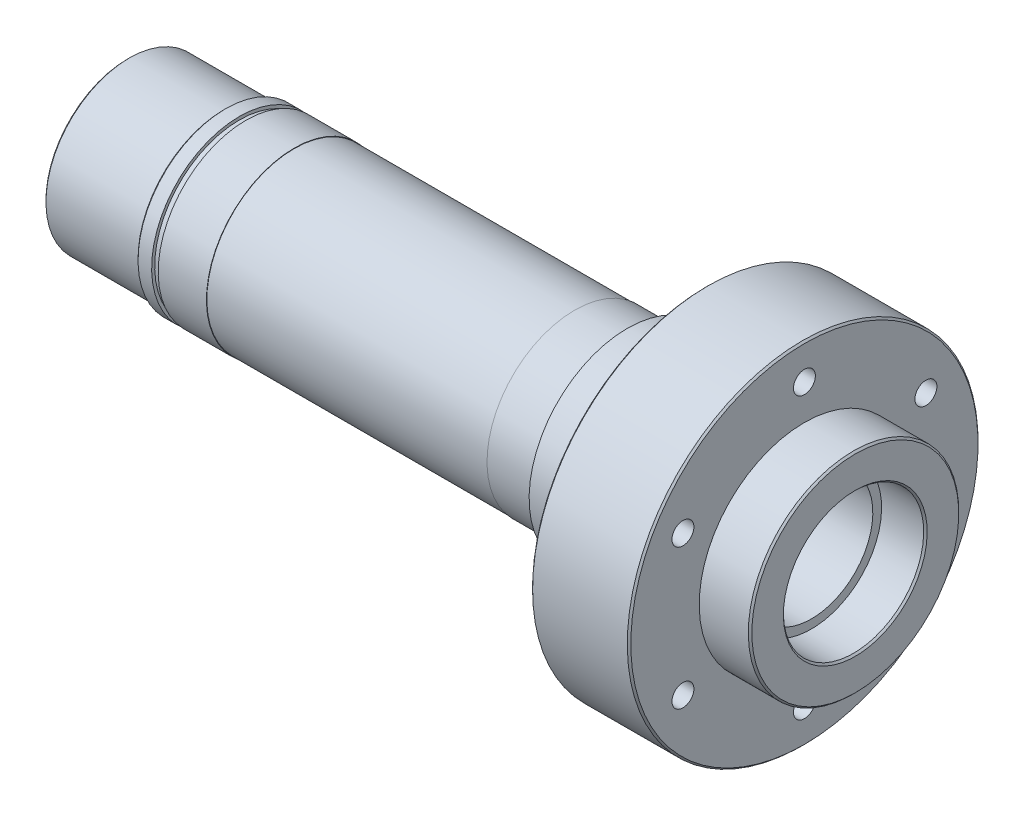
ISO-10303-21;
HEADER;
FILE_DESCRIPTION(('STEP AP214'),'2;1');
FILE_NAME('part.step','',(''),(''),'','','');
FILE_SCHEMA(('AUTOMOTIVE_DESIGN { 1 0 10303 214 1 1 1 1 }'));
ENDSEC;
DATA;
#1=APPLICATION_CONTEXT('core data for automotive mechanical design processes');
#2=APPLICATION_PROTOCOL_DEFINITION('international standard','automotive_design',2000,#1);
#3=PRODUCT_CONTEXT('',#1,'mechanical');
#4=PRODUCT('Part','Part','',(#3));
#5=PRODUCT_RELATED_PRODUCT_CATEGORY('part','',(#4));
#6=PRODUCT_DEFINITION_FORMATION('','',#4);
#7=PRODUCT_DEFINITION_CONTEXT('part definition',#1,'design');
#8=PRODUCT_DEFINITION('design','',#6,#7);
#9=PRODUCT_DEFINITION_SHAPE('','',#8);
#10=(LENGTH_UNIT() NAMED_UNIT(*) SI_UNIT(.MILLI.,.METRE.));
#11=(NAMED_UNIT(*) PLANE_ANGLE_UNIT() SI_UNIT($,.RADIAN.));
#12=(NAMED_UNIT(*) SI_UNIT($,.STERADIAN.) SOLID_ANGLE_UNIT());
#13=UNCERTAINTY_MEASURE_WITH_UNIT(LENGTH_MEASURE(1.E-05),#10,'distance_accuracy_value','');
#14=(GEOMETRIC_REPRESENTATION_CONTEXT(3) GLOBAL_UNCERTAINTY_ASSIGNED_CONTEXT((#13)) GLOBAL_UNIT_ASSIGNED_CONTEXT((#10,
#11,#12)) REPRESENTATION_CONTEXT('',''));
#15=CARTESIAN_POINT('',(0.,0.,0.));
#16=DIRECTION('',(0.,0.,1.));
#17=DIRECTION('',(1.,0.,0.));
#18=AXIS2_PLACEMENT_3D('',#15,#16,#17);
#19=CARTESIAN_POINT('',(0.,0.,0.));
#20=DIRECTION('',(1.,0.,0.));
#21=DIRECTION('',(0.,1.,0.));
#22=AXIS2_PLACEMENT_3D('',#19,#20,#21);
#23=CYLINDRICAL_SURFACE('',#22,50.);
#24=CARTESIAN_POINT('',(-16.3696821815825,0.,0.));
#25=DIRECTION('',(1.,0.,0.));
#26=DIRECTION('',(0.,1.,0.));
#27=AXIS2_PLACEMENT_3D('',#24,#25,#26);
#28=CIRCLE('',#27,50.);
#29=CARTESIAN_POINT('',(-16.3696821815825,50.,0.));
#30=VERTEX_POINT('',#29);
#31=EDGE_CURVE('E106',#30,#30,#28,.T.);
#32=ORIENTED_EDGE('',*,*,#31,.T.);
#33=EDGE_LOOP('',(#32));
#34=FACE_BOUND('',#33,.T.);
#35=CARTESIAN_POINT('',(13.6303178184175,0.,0.));
#36=DIRECTION('',(1.,0.,0.));
#37=DIRECTION('',(0.,1.,0.));
#38=AXIS2_PLACEMENT_3D('',#35,#36,#37);
#39=CIRCLE('',#38,50.);
#40=CARTESIAN_POINT('',(13.6303178184175,50.,0.));
#41=VERTEX_POINT('',#40);
#42=EDGE_CURVE('E178',#41,#41,#39,.T.);
#43=ORIENTED_EDGE('',*,*,#42,.F.);
#44=EDGE_LOOP('',(#43));
#45=FACE_BOUND('',#44,.T.);
#46=ADVANCED_FACE('F41',(#34,#45),#23,.T.);
#47=CARTESIAN_POINT('',(-16.3696821815825,-6.81524927392023E-13,0.));
#48=DIRECTION('',(-1.,0.,0.));
#49=DIRECTION('',(0.,-1.,0.));
#50=AXIS2_PLACEMENT_3D('',#47,#48,#49);
#51=PLANE('',#50);
#52=CARTESIAN_POINT('',(-16.3696821815825,0.,0.));
#53=DIRECTION('',(1.,0.,0.));
#54=DIRECTION('',(0.,1.,0.));
#55=AXIS2_PLACEMENT_3D('',#52,#53,#54);
#56=CIRCLE('',#55,49.75);
#57=CARTESIAN_POINT('',(-16.3696821815825,49.75,0.));
#58=VERTEX_POINT('',#57);
#59=EDGE_CURVE('E110',#58,#58,#56,.T.);
#60=ORIENTED_EDGE('',*,*,#59,.T.);
#61=EDGE_LOOP('',(#60));
#62=FACE_BOUND('',#61,.T.);
#63=ORIENTED_EDGE('',*,*,#31,.F.);
#64=EDGE_LOOP('',(#63));
#65=FACE_BOUND('',#64,.T.);
#66=ADVANCED_FACE('F259',(#62,#65),#51,.T.);
#67=CARTESIAN_POINT('',(0.,0.,0.));
#68=DIRECTION('',(1.,0.,0.));
#69=DIRECTION('',(0.,1.,0.));
#70=AXIS2_PLACEMENT_3D('',#67,#68,#69);
#71=CYLINDRICAL_SURFACE('',#70,49.75);
#72=ORIENTED_EDGE('',*,*,#59,.F.);
#73=EDGE_LOOP('',(#72));
#74=FACE_BOUND('',#73,.T.);
#75=CARTESIAN_POINT('',(-176.369682181583,0.,0.));
#76=DIRECTION('',(1.,0.,0.));
#77=DIRECTION('',(0.,1.,0.));
#78=AXIS2_PLACEMENT_3D('',#75,#76,#77);
#79=CIRCLE('',#78,49.75);
#80=CARTESIAN_POINT('',(-176.369682181583,49.75,0.));
#81=VERTEX_POINT('',#80);
#82=EDGE_CURVE('E114',#81,#81,#79,.T.);
#83=ORIENTED_EDGE('',*,*,#82,.T.);
#84=EDGE_LOOP('',(#83));
#85=FACE_BOUND('',#84,.T.);
#86=ADVANCED_FACE('F265',(#74,#85),#71,.T.);
#87=CARTESIAN_POINT('',(-176.369682181583,0.,0.));
#88=DIRECTION('',(-1.,0.,0.));
#89=DIRECTION('',(0.,-1.,0.));
#90=AXIS2_PLACEMENT_3D('',#87,#88,#89);
#91=PLANE('',#90);
#92=ORIENTED_EDGE('',*,*,#82,.F.);
#93=EDGE_LOOP('',(#92));
#94=FACE_BOUND('',#93,.T.);
#95=CARTESIAN_POINT('',(-176.369682181583,0.,0.));
#96=DIRECTION('',(1.,0.,0.));
#97=DIRECTION('',(0.,1.,0.));
#98=AXIS2_PLACEMENT_3D('',#95,#96,#97);
#99=CIRCLE('',#98,50.);
#100=CARTESIAN_POINT('',(-176.369682181583,50.,0.));
#101=VERTEX_POINT('',#100);
#102=EDGE_CURVE('E118',#101,#101,#99,.T.);
#103=ORIENTED_EDGE('',*,*,#102,.T.);
#104=EDGE_LOOP('',(#103));
#105=FACE_BOUND('',#104,.T.);
#106=ADVANCED_FACE('F355',(#94,#105),#91,.F.);
#107=CARTESIAN_POINT('',(0.,0.,0.));
#108=DIRECTION('',(1.,0.,0.));
#109=DIRECTION('',(0.,1.,0.));
#110=AXIS2_PLACEMENT_3D('',#107,#108,#109);
#111=CYLINDRICAL_SURFACE('',#110,50.);
#112=ORIENTED_EDGE('',*,*,#102,.F.);
#113=EDGE_LOOP('',(#112));
#114=FACE_BOUND('',#113,.T.);
#115=CARTESIAN_POINT('',(-203.869682181583,0.,0.));
#116=DIRECTION('',(1.,0.,0.));
#117=DIRECTION('',(0.,1.,0.));
#118=AXIS2_PLACEMENT_3D('',#115,#116,#117);
#119=CIRCLE('',#118,50.);
#120=CARTESIAN_POINT('',(-203.869682181583,50.,0.));
#121=VERTEX_POINT('',#120);
#122=EDGE_CURVE('E122',#121,#121,#119,.T.);
#123=ORIENTED_EDGE('',*,*,#122,.T.);
#124=EDGE_LOOP('',(#123));
#125=FACE_BOUND('',#124,.T.);
#126=ADVANCED_FACE('F351',(#114,#125),#111,.T.);
#127=CARTESIAN_POINT('',(-203.869682181583,0.,0.));
#128=DIRECTION('',(1.,0.,0.));
#129=DIRECTION('',(0.,1.,0.));
#130=AXIS2_PLACEMENT_3D('',#127,#128,#129);
#131=PLANE('',#130);
#132=ORIENTED_EDGE('',*,*,#122,.F.);
#133=EDGE_LOOP('',(#132));
#134=FACE_BOUND('',#133,.T.);
#135=CARTESIAN_POINT('',(-203.869682181583,0.,0.));
#136=DIRECTION('',(1.,0.,0.));
#137=DIRECTION('',(0.,1.,0.));
#138=AXIS2_PLACEMENT_3D('',#135,#136,#137);
#139=CIRCLE('',#138,48.25);
#140=CARTESIAN_POINT('',(-203.869682181583,48.25,0.));
#141=VERTEX_POINT('',#140);
#142=EDGE_CURVE('E126',#141,#141,#139,.T.);
#143=ORIENTED_EDGE('',*,*,#142,.T.);
#144=EDGE_LOOP('',(#143));
#145=FACE_BOUND('',#144,.T.);
#146=ADVANCED_FACE('F347',(#134,#145),#131,.F.);
#147=CARTESIAN_POINT('',(0.,0.,0.));
#148=DIRECTION('',(1.,0.,0.));
#149=DIRECTION('',(0.,1.,0.));
#150=AXIS2_PLACEMENT_3D('',#147,#148,#149);
#151=CYLINDRICAL_SURFACE('',#150,48.25);
#152=ORIENTED_EDGE('',*,*,#142,.F.);
#153=EDGE_LOOP('',(#152));
#154=FACE_BOUND('',#153,.T.);
#155=CARTESIAN_POINT('',(-207.619682181583,0.,0.));
#156=DIRECTION('',(1.,0.,0.));
#157=DIRECTION('',(0.,1.,0.));
#158=AXIS2_PLACEMENT_3D('',#155,#156,#157);
#159=CIRCLE('',#158,48.25);
#160=CARTESIAN_POINT('',(-207.619682181583,48.25,0.));
#161=VERTEX_POINT('',#160);
#162=EDGE_CURVE('E130',#161,#161,#159,.T.);
#163=ORIENTED_EDGE('',*,*,#162,.T.);
#164=EDGE_LOOP('',(#163));
#165=FACE_BOUND('',#164,.T.);
#166=ADVANCED_FACE('F343',(#154,#165),#151,.T.);
#167=CARTESIAN_POINT('',(-207.619682181583,0.,0.));
#168=DIRECTION('',(-1.,0.,0.));
#169=DIRECTION('',(0.,-1.,0.));
#170=AXIS2_PLACEMENT_3D('',#167,#168,#169);
#171=PLANE('',#170);
#172=ORIENTED_EDGE('',*,*,#162,.F.);
#173=EDGE_LOOP('',(#172));
#174=FACE_BOUND('',#173,.T.);
#175=CARTESIAN_POINT('',(-207.619682181583,0.,0.));
#176=DIRECTION('',(1.,0.,0.));
#177=DIRECTION('',(0.,1.,0.));
#178=AXIS2_PLACEMENT_3D('',#175,#176,#177);
#179=CIRCLE('',#178,50.);
#180=CARTESIAN_POINT('',(-207.619682181583,50.,0.));
#181=VERTEX_POINT('',#180);
#182=EDGE_CURVE('E134',#181,#181,#179,.T.);
#183=ORIENTED_EDGE('',*,*,#182,.T.);
#184=EDGE_LOOP('',(#183));
#185=FACE_BOUND('',#184,.T.);
#186=ADVANCED_FACE('F336',(#174,#185),#171,.F.);
#187=CARTESIAN_POINT('',(0.,0.,0.));
#188=DIRECTION('',(1.,0.,0.));
#189=DIRECTION('',(0.,1.,0.));
#190=AXIS2_PLACEMENT_3D('',#187,#188,#189);
#191=CYLINDRICAL_SURFACE('',#190,50.);
#192=CARTESIAN_POINT('',(-215.369682181583,0.,0.));
#193=DIRECTION('',(1.,0.,0.));
#194=DIRECTION('',(0.,1.,0.));
#195=AXIS2_PLACEMENT_3D('',#192,#193,#194);
#196=CIRCLE('',#195,50.);
#197=CARTESIAN_POINT('',(-215.369682181583,50.,0.));
#198=VERTEX_POINT('',#197);
#199=EDGE_CURVE('E78',#198,#198,#196,.T.);
#200=ORIENTED_EDGE('',*,*,#199,.T.);
#201=EDGE_LOOP('',(#200));
#202=FACE_BOUND('',#201,.T.);
#203=ORIENTED_EDGE('',*,*,#182,.F.);
#204=EDGE_LOOP('',(#203));
#205=FACE_BOUND('',#204,.T.);
#206=ADVANCED_FACE('F330',(#202,#205),#191,.T.);
#207=CARTESIAN_POINT('',(-216.369682181583,0.,0.));
#208=DIRECTION('',(1.,0.,0.));
#209=DIRECTION('',(0.,1.,0.));
#210=AXIS2_PLACEMENT_3D('',#207,#208,#209);
#211=PLANE('',#210);
#212=CARTESIAN_POINT('',(-216.369682181583,0.,0.));
#213=DIRECTION('',(1.,0.,0.));
#214=DIRECTION('',(0.,1.,0.));
#215=AXIS2_PLACEMENT_3D('',#212,#213,#214);
#216=CIRCLE('',#215,49.);
#217=CARTESIAN_POINT('',(-216.369682181583,49.,0.));
#218=VERTEX_POINT('',#217);
#219=EDGE_CURVE('E74',#218,#218,#216,.F.);
#220=ORIENTED_EDGE('',*,*,#219,.T.);
#221=EDGE_LOOP('',(#220));
#222=FACE_BOUND('',#221,.T.);
#223=CARTESIAN_POINT('',(-216.369682181583,0.,0.));
#224=DIRECTION('',(1.,0.,0.));
#225=DIRECTION('',(0.,1.,0.));
#226=AXIS2_PLACEMENT_3D('',#223,#224,#225);
#227=CIRCLE('',#226,47.5);
#228=CARTESIAN_POINT('',(-216.369682181583,47.5,0.));
#229=VERTEX_POINT('',#228);
#230=EDGE_CURVE('E138',#229,#229,#227,.T.);
#231=ORIENTED_EDGE('',*,*,#230,.T.);
#232=EDGE_LOOP('',(#231));
#233=FACE_BOUND('',#232,.T.);
#234=ADVANCED_FACE('F325',(#222,#233),#211,.F.);
#235=CARTESIAN_POINT('',(0.,0.,0.));
#236=DIRECTION('',(1.,0.,0.));
#237=DIRECTION('',(0.,1.,0.));
#238=AXIS2_PLACEMENT_3D('',#235,#236,#237);
#239=CYLINDRICAL_SURFACE('',#238,47.5);
#240=CARTESIAN_POINT('',(-270.369682181583,0.,0.));
#241=DIRECTION('',(1.,0.,0.));
#242=DIRECTION('',(0.,1.,0.));
#243=AXIS2_PLACEMENT_3D('',#240,#241,#242);
#244=CIRCLE('',#243,47.5);
#245=CARTESIAN_POINT('',(-270.369682181583,47.5,0.));
#246=VERTEX_POINT('',#245);
#247=EDGE_CURVE('E55',#246,#246,#244,.T.);
#248=ORIENTED_EDGE('',*,*,#247,.T.);
#249=EDGE_LOOP('',(#248));
#250=FACE_BOUND('',#249,.T.);
#251=ORIENTED_EDGE('',*,*,#230,.F.);
#252=EDGE_LOOP('',(#251));
#253=FACE_BOUND('',#252,.T.);
#254=ADVANCED_FACE('F321',(#250,#253),#239,.T.);
#255=CARTESIAN_POINT('',(-271.369682181583,0.,0.));
#256=DIRECTION('',(1.,0.,0.));
#257=DIRECTION('',(0.,1.,0.));
#258=AXIS2_PLACEMENT_3D('',#255,#256,#257);
#259=PLANE('',#258);
#260=CARTESIAN_POINT('',(-271.369682181583,0.,0.));
#261=DIRECTION('',(1.,0.,0.));
#262=DIRECTION('',(0.,1.,0.));
#263=AXIS2_PLACEMENT_3D('',#260,#261,#262);
#264=CIRCLE('',#263,40.9999999999999);
#265=CARTESIAN_POINT('',(-271.369682181583,40.9999999999999,0.));
#266=VERTEX_POINT('',#265);
#267=EDGE_CURVE('E66',#266,#266,#264,.T.);
#268=ORIENTED_EDGE('',*,*,#267,.T.);
#269=EDGE_LOOP('',(#268));
#270=FACE_BOUND('',#269,.T.);
#271=CARTESIAN_POINT('',(-271.369682181583,0.,0.));
#272=DIRECTION('',(1.,0.,0.));
#273=DIRECTION('',(0.,1.,0.));
#274=AXIS2_PLACEMENT_3D('',#271,#272,#273);
#275=CIRCLE('',#274,46.5);
#276=CARTESIAN_POINT('',(-271.369682181583,46.5,0.));
#277=VERTEX_POINT('',#276);
#278=EDGE_CURVE('E70',#277,#277,#275,.F.);
#279=ORIENTED_EDGE('',*,*,#278,.T.);
#280=EDGE_LOOP('',(#279));
#281=FACE_BOUND('',#280,.T.);
#282=ADVANCED_FACE('F324',(#270,#281),#259,.F.);
#283=CARTESIAN_POINT('',(0.,0.,0.));
#284=DIRECTION('',(1.,0.,0.));
#285=DIRECTION('',(0.,1.,0.));
#286=AXIS2_PLACEMENT_3D('',#283,#284,#285);
#287=CYLINDRICAL_SURFACE('',#286,40.);
#288=CARTESIAN_POINT('',(-270.369682181583,0.,0.));
#289=DIRECTION('',(1.,0.,0.));
#290=DIRECTION('',(0.,1.,0.));
#291=AXIS2_PLACEMENT_3D('',#288,#289,#290);
#292=CIRCLE('',#291,40.);
#293=CARTESIAN_POINT('',(-270.369682181583,40.,0.));
#294=VERTEX_POINT('',#293);
#295=EDGE_CURVE('E60',#294,#294,#292,.F.);
#296=ORIENTED_EDGE('',*,*,#295,.T.);
#297=EDGE_LOOP('',(#296));
#298=FACE_BOUND('',#297,.T.);
#299=CARTESIAN_POINT('',(-246.369682181583,0.,0.));
#300=DIRECTION('',(1.,0.,0.));
#301=DIRECTION('',(0.,1.,0.));
#302=AXIS2_PLACEMENT_3D('',#299,#300,#301);
#303=CIRCLE('',#302,40.);
#304=CARTESIAN_POINT('',(-246.369682181583,40.,0.));
#305=VERTEX_POINT('',#304);
#306=EDGE_CURVE('E142',#305,#305,#303,.T.);
#307=ORIENTED_EDGE('',*,*,#306,.T.);
#308=EDGE_LOOP('',(#307));
#309=FACE_BOUND('',#308,.T.);
#310=ADVANCED_FACE('F429',(#298,#309),#287,.F.);
#311=CARTESIAN_POINT('',(-246.369682181583,0.,0.));
#312=DIRECTION('',(-1.,0.,0.));
#313=DIRECTION('',(0.,-1.,0.));
#314=AXIS2_PLACEMENT_3D('',#311,#312,#313);
#315=PLANE('',#314);
#316=CARTESIAN_POINT('',(-246.369682181583,0.,0.));
#317=DIRECTION('',(1.,0.,0.));
#318=DIRECTION('',(0.,1.,0.));
#319=AXIS2_PLACEMENT_3D('',#316,#317,#318);
#320=CIRCLE('',#319,35.);
#321=CARTESIAN_POINT('',(-246.369682181583,35.,0.));
#322=VERTEX_POINT('',#321);
#323=EDGE_CURVE('E146',#322,#322,#320,.T.);
#324=ORIENTED_EDGE('',*,*,#323,.T.);
#325=EDGE_LOOP('',(#324));
#326=FACE_BOUND('',#325,.T.);
#327=ORIENTED_EDGE('',*,*,#306,.F.);
#328=EDGE_LOOP('',(#327));
#329=FACE_BOUND('',#328,.T.);
#330=ADVANCED_FACE('F438',(#326,#329),#315,.T.);
#331=CARTESIAN_POINT('',(0.,0.,0.));
#332=DIRECTION('',(1.,0.,0.));
#333=DIRECTION('',(0.,1.,0.));
#334=AXIS2_PLACEMENT_3D('',#331,#332,#333);
#335=CYLINDRICAL_SURFACE('',#334,35.);
#336=CARTESIAN_POINT('',(118.630317818417,0.,0.));
#337=DIRECTION('',(1.,0.,0.));
#338=DIRECTION('',(0.,1.,0.));
#339=AXIS2_PLACEMENT_3D('',#336,#337,#338);
#340=CIRCLE('',#339,35.);
#341=CARTESIAN_POINT('',(118.630317818417,35.,0.));
#342=VERTEX_POINT('',#341);
#343=EDGE_CURVE('E150',#342,#342,#340,.T.);
#344=ORIENTED_EDGE('',*,*,#343,.T.);
#345=EDGE_LOOP('',(#344));
#346=FACE_BOUND('',#345,.T.);
#347=ORIENTED_EDGE('',*,*,#323,.F.);
#348=EDGE_LOOP('',(#347));
#349=FACE_BOUND('',#348,.T.);
#350=ADVANCED_FACE('F624',(#346,#349),#335,.F.);
#351=CARTESIAN_POINT('',(118.630317818417,6.58530551303031E-13,0.));
#352=DIRECTION('',(1.,0.,0.));
#353=DIRECTION('',(0.,1.,0.));
#354=AXIS2_PLACEMENT_3D('',#351,#352,#353);
#355=PLANE('',#354);
#356=CARTESIAN_POINT('',(118.630317818417,0.,0.));
#357=DIRECTION('',(1.,0.,0.));
#358=DIRECTION('',(0.,1.,0.));
#359=AXIS2_PLACEMENT_3D('',#356,#357,#358);
#360=CIRCLE('',#359,40.);
#361=CARTESIAN_POINT('',(118.630317818417,40.,0.));
#362=VERTEX_POINT('',#361);
#363=EDGE_CURVE('E154',#362,#362,#360,.T.);
#364=ORIENTED_EDGE('',*,*,#363,.T.);
#365=EDGE_LOOP('',(#364));
#366=FACE_BOUND('',#365,.T.);
#367=ORIENTED_EDGE('',*,*,#343,.F.);
#368=EDGE_LOOP('',(#367));
#369=FACE_BOUND('',#368,.T.);
#370=ADVANCED_FACE('F450',(#366,#369),#355,.T.);
#371=CARTESIAN_POINT('',(0.,0.,0.));
#372=DIRECTION('',(1.,0.,0.));
#373=DIRECTION('',(0.,1.,0.));
#374=AXIS2_PLACEMENT_3D('',#371,#372,#373);
#375=CYLINDRICAL_SURFACE('',#374,40.);
#376=CARTESIAN_POINT('',(142.630317818417,0.,0.));
#377=DIRECTION('',(1.,0.,0.));
#378=DIRECTION('',(0.,1.,0.));
#379=AXIS2_PLACEMENT_3D('',#376,#377,#378);
#380=CIRCLE('',#379,40.);
#381=CARTESIAN_POINT('',(142.630317818417,40.,0.));
#382=VERTEX_POINT('',#381);
#383=EDGE_CURVE('E50',#382,#382,#380,.T.);
#384=ORIENTED_EDGE('',*,*,#383,.T.);
#385=EDGE_LOOP('',(#384));
#386=FACE_BOUND('',#385,.T.);
#387=ORIENTED_EDGE('',*,*,#363,.F.);
#388=EDGE_LOOP('',(#387));
#389=FACE_BOUND('',#388,.T.);
#390=ADVANCED_FACE('F256',(#386,#389),#375,.F.);
#391=CARTESIAN_POINT('',(143.630317818417,0.,0.));
#392=DIRECTION('',(1.,0.,0.));
#393=DIRECTION('',(0.,1.,0.));
#394=AXIS2_PLACEMENT_3D('',#391,#392,#393);
#395=PLANE('',#394);
#396=CARTESIAN_POINT('',(143.630317818417,0.,0.));
#397=DIRECTION('',(1.,0.,0.));
#398=DIRECTION('',(0.,1.,0.));
#399=AXIS2_PLACEMENT_3D('',#396,#397,#398);
#400=CIRCLE('',#399,41.);
#401=CARTESIAN_POINT('',(143.630317818417,41.,0.));
#402=VERTEX_POINT('',#401);
#403=EDGE_CURVE('E10',#402,#402,#400,.F.);
#404=ORIENTED_EDGE('',*,*,#403,.T.);
#405=EDGE_LOOP('',(#404));
#406=FACE_BOUND('',#405,.T.);
#407=CARTESIAN_POINT('',(143.630317818417,0.,0.));
#408=DIRECTION('',(1.,0.,0.));
#409=DIRECTION('',(0.,1.,0.));
#410=AXIS2_PLACEMENT_3D('',#407,#408,#409);
#411=CIRCLE('',#410,59.);
#412=CARTESIAN_POINT('',(143.630317818417,59.0000000000001,0.));
#413=VERTEX_POINT('',#412);
#414=EDGE_CURVE('E90',#413,#413,#411,.T.);
#415=ORIENTED_EDGE('',*,*,#414,.T.);
#416=EDGE_LOOP('',(#415));
#417=FACE_BOUND('',#416,.T.);
#418=ADVANCED_FACE('F250',(#406,#417),#395,.T.);
#419=CARTESIAN_POINT('',(0.,0.,0.));
#420=DIRECTION('',(1.,0.,0.));
#421=DIRECTION('',(0.,1.,0.));
#422=AXIS2_PLACEMENT_3D('',#419,#420,#421);
#423=CYLINDRICAL_SURFACE('',#422,60.);
#424=CARTESIAN_POINT('',(142.630317818418,0.,0.));
#425=DIRECTION('',(1.,0.,0.));
#426=DIRECTION('',(0.,1.,0.));
#427=AXIS2_PLACEMENT_3D('',#424,#425,#426);
#428=CIRCLE('',#427,60.);
#429=CARTESIAN_POINT('',(142.630317818418,60.,0.));
#430=VERTEX_POINT('',#429);
#431=EDGE_CURVE('E86',#430,#430,#428,.F.);
#432=ORIENTED_EDGE('',*,*,#431,.T.);
#433=EDGE_LOOP('',(#432));
#434=FACE_BOUND('',#433,.T.);
#435=CARTESIAN_POINT('',(114.630317818417,0.,0.));
#436=DIRECTION('',(1.,0.,0.));
#437=DIRECTION('',(0.,1.,0.));
#438=AXIS2_PLACEMENT_3D('',#435,#436,#437);
#439=CIRCLE('',#438,60.);
#440=CARTESIAN_POINT('',(114.630317818417,60.,0.));
#441=VERTEX_POINT('',#440);
#442=EDGE_CURVE('E158',#441,#441,#439,.T.);
#443=ORIENTED_EDGE('',*,*,#442,.T.);
#444=EDGE_LOOP('',(#443));
#445=FACE_BOUND('',#444,.T.);
#446=ADVANCED_FACE('F238',(#434,#445),#423,.T.);
#447=CARTESIAN_POINT('',(114.630317818417,0.,0.));
#448=DIRECTION('',(1.,0.,0.));
#449=DIRECTION('',(0.,1.,0.));
#450=AXIS2_PLACEMENT_3D('',#447,#448,#449);
#451=PLANE('',#450);
#452=CARTESIAN_POINT('',(114.630317818417,-40.0000000000008,69.2820323027546));
#453=DIRECTION('',(1.,0.,0.));
#454=DIRECTION('',(0.,0.50000000000001,-0.866025403784433));
#455=AXIS2_PLACEMENT_3D('',#452,#453,#454);
#456=CIRCLE('',#455,6.25);
#457=CARTESIAN_POINT('',(114.630317818417,-36.8750000000007,63.8693735291019));
#458=VERTEX_POINT('',#457);
#459=EDGE_CURVE('E204',#458,#458,#456,.T.);
#460=ORIENTED_EDGE('',*,*,#459,.F.);
#461=EDGE_LOOP('',(#460));
#462=FACE_BOUND('',#461,.T.);
#463=CARTESIAN_POINT('',(114.630317818417,39.9999999999994,69.2820323027555));
#464=DIRECTION('',(1.,0.,0.));
#465=DIRECTION('',(0.,-0.499999999999992,-0.866025403784443));
#466=AXIS2_PLACEMENT_3D('',#463,#464,#465);
#467=CIRCLE('',#466,6.25);
#468=CARTESIAN_POINT('',(114.630317818417,36.8749999999994,63.8693735291027));
#469=VERTEX_POINT('',#468);
#470=EDGE_CURVE('E203',#469,#469,#467,.T.);
#471=ORIENTED_EDGE('',*,*,#470,.F.);
#472=EDGE_LOOP('',(#471));
#473=FACE_BOUND('',#472,.T.);
#474=CARTESIAN_POINT('',(114.630317818417,80.,0.));
#475=DIRECTION('',(1.,0.,0.));
#476=DIRECTION('',(0.,-1.,0.));
#477=AXIS2_PLACEMENT_3D('',#474,#475,#476);
#478=CIRCLE('',#477,6.25);
#479=CARTESIAN_POINT('',(114.630317818417,73.75,0.));
#480=VERTEX_POINT('',#479);
#481=EDGE_CURVE('E212',#480,#480,#478,.T.);
#482=ORIENTED_EDGE('',*,*,#481,.F.);
#483=EDGE_LOOP('',(#482));
#484=FACE_BOUND('',#483,.T.);
#485=CARTESIAN_POINT('',(114.630317818417,40.0000000000003,-69.2820323027549));
#486=DIRECTION('',(1.,0.,0.));
#487=DIRECTION('',(0.,-0.500000000000004,0.866025403784436));
#488=AXIS2_PLACEMENT_3D('',#485,#486,#487);
#489=CIRCLE('',#488,6.25);
#490=CARTESIAN_POINT('',(114.630317818417,36.8750000000003,-63.8693735291022));
#491=VERTEX_POINT('',#490);
#492=EDGE_CURVE('E220',#491,#491,#489,.T.);
#493=ORIENTED_EDGE('',*,*,#492,.F.);
#494=EDGE_LOOP('',(#493));
#495=FACE_BOUND('',#494,.T.);
#496=CARTESIAN_POINT('',(114.630317818417,-39.9999999999998,-69.2820323027552));
#497=DIRECTION('',(1.,0.,0.));
#498=DIRECTION('',(0.,0.499999999999998,0.86602540378444));
#499=AXIS2_PLACEMENT_3D('',#496,#497,#498);
#500=CIRCLE('',#499,6.25);
#501=CARTESIAN_POINT('',(114.630317818417,-36.8749999999998,-63.8693735291024));
#502=VERTEX_POINT('',#501);
#503=EDGE_CURVE('E194',#502,#502,#500,.T.);
#504=ORIENTED_EDGE('',*,*,#503,.F.);
#505=EDGE_LOOP('',(#504));
#506=FACE_BOUND('',#505,.T.);
#507=CARTESIAN_POINT('',(114.630317818417,-80.,0.));
#508=DIRECTION('',(1.,0.,0.));
#509=DIRECTION('',(0.,1.,0.));
#510=AXIS2_PLACEMENT_3D('',#507,#508,#509);
#511=CIRCLE('',#510,6.25);
#512=CARTESIAN_POINT('',(114.630317818417,-73.75,0.));
#513=VERTEX_POINT('',#512);
#514=EDGE_CURVE('E186',#513,#513,#511,.T.);
#515=ORIENTED_EDGE('',*,*,#514,.F.);
#516=EDGE_LOOP('',(#515));
#517=FACE_BOUND('',#516,.T.);
#518=CARTESIAN_POINT('',(114.630317818417,0.,0.));
#519=DIRECTION('',(1.,0.,0.));
#520=DIRECTION('',(0.,1.,0.));
#521=AXIS2_PLACEMENT_3D('',#518,#519,#520);
#522=CIRCLE('',#521,98.9999999999999);
#523=CARTESIAN_POINT('',(114.630317818417,99.,0.));
#524=VERTEX_POINT('',#523);
#525=EDGE_CURVE('E102',#524,#524,#522,.T.);
#526=ORIENTED_EDGE('',*,*,#525,.T.);
#527=EDGE_LOOP('',(#526));
#528=FACE_BOUND('',#527,.T.);
#529=ORIENTED_EDGE('',*,*,#442,.F.);
#530=EDGE_LOOP('',(#529));
#531=FACE_BOUND('',#530,.T.);
#532=ADVANCED_FACE('F234',(#462,#473,#484,#495,#506,#517,#528,#531),#451,.T.);
#533=CARTESIAN_POINT('',(0.,0.,0.));
#534=DIRECTION('',(1.,0.,0.));
#535=DIRECTION('',(0.,1.,0.));
#536=AXIS2_PLACEMENT_3D('',#533,#534,#535);
#537=CYLINDRICAL_SURFACE('',#536,100.);
#538=CARTESIAN_POINT('',(113.630317818417,0.,0.));
#539=DIRECTION('',(1.,0.,0.));
#540=DIRECTION('',(0.,1.,0.));
#541=AXIS2_PLACEMENT_3D('',#538,#539,#540);
#542=CIRCLE('',#541,100.);
#543=CARTESIAN_POINT('',(113.630317818417,100.,0.));
#544=VERTEX_POINT('',#543);
#545=EDGE_CURVE('E94',#544,#544,#542,.F.);
#546=ORIENTED_EDGE('',*,*,#545,.T.);
#547=EDGE_LOOP('',(#546));
#548=FACE_BOUND('',#547,.T.);
#549=CARTESIAN_POINT('',(59.6303178184175,0.,0.));
#550=DIRECTION('',(-1.,0.,0.));
#551=DIRECTION('',(0.,-1.,0.));
#552=AXIS2_PLACEMENT_3D('',#549,#550,#551);
#553=CIRCLE('',#552,100.);
#554=CARTESIAN_POINT('',(59.6303178184175,-100.,0.));
#555=VERTEX_POINT('',#554);
#556=EDGE_CURVE('E98',#555,#555,#553,.F.);
#557=ORIENTED_EDGE('',*,*,#556,.T.);
#558=EDGE_LOOP('',(#557));
#559=FACE_BOUND('',#558,.T.);
#560=ADVANCED_FACE('F237',(#548,#559),#537,.T.);
#561=CARTESIAN_POINT('',(58.6303178184175,0.,0.));
#562=DIRECTION('',(-1.,0.,0.));
#563=DIRECTION('',(0.,-1.,0.));
#564=AXIS2_PLACEMENT_3D('',#561,#562,#563);
#565=PLANE('',#564);
#566=CARTESIAN_POINT('',(58.6303178184175,-40.0000000000008,69.2820323027546));
#567=DIRECTION('',(-1.,0.,0.));
#568=DIRECTION('',(0.,-1.,0.));
#569=AXIS2_PLACEMENT_3D('',#566,#567,#568);
#570=CIRCLE('',#569,6.25);
#571=CARTESIAN_POINT('',(58.6303178184175,-46.2500000000008,69.2820323027546));
#572=VERTEX_POINT('',#571);
#573=EDGE_CURVE('E199',#572,#572,#570,.F.);
#574=ORIENTED_EDGE('',*,*,#573,.T.);
#575=EDGE_LOOP('',(#574));
#576=FACE_BOUND('',#575,.T.);
#577=CARTESIAN_POINT('',(58.6303178184175,39.9999999999994,69.2820323027555));
#578=DIRECTION('',(-1.,0.,0.));
#579=DIRECTION('',(0.,-1.,0.));
#580=AXIS2_PLACEMENT_3D('',#577,#578,#579);
#581=CIRCLE('',#580,6.25);
#582=CARTESIAN_POINT('',(58.6303178184175,33.7499999999994,69.2820323027555));
#583=VERTEX_POINT('',#582);
#584=EDGE_CURVE('E208',#583,#583,#581,.F.);
#585=ORIENTED_EDGE('',*,*,#584,.T.);
#586=EDGE_LOOP('',(#585));
#587=FACE_BOUND('',#586,.T.);
#588=CARTESIAN_POINT('',(58.6303178184175,80.,0.));
#589=DIRECTION('',(-1.,0.,0.));
#590=DIRECTION('',(0.,-1.,0.));
#591=AXIS2_PLACEMENT_3D('',#588,#589,#590);
#592=CIRCLE('',#591,6.25);
#593=CARTESIAN_POINT('',(58.6303178184175,73.75,0.));
#594=VERTEX_POINT('',#593);
#595=EDGE_CURVE('E216',#594,#594,#592,.F.);
#596=ORIENTED_EDGE('',*,*,#595,.T.);
#597=EDGE_LOOP('',(#596));
#598=FACE_BOUND('',#597,.T.);
#599=CARTESIAN_POINT('',(58.6303178184175,40.0000000000003,-69.2820323027549));
#600=DIRECTION('',(-1.,0.,0.));
#601=DIRECTION('',(0.,-1.,0.));
#602=AXIS2_PLACEMENT_3D('',#599,#600,#601);
#603=CIRCLE('',#602,6.25);
#604=CARTESIAN_POINT('',(58.6303178184175,33.7500000000003,-69.2820323027549));
#605=VERTEX_POINT('',#604);
#606=EDGE_CURVE('E198',#605,#605,#603,.F.);
#607=ORIENTED_EDGE('',*,*,#606,.T.);
#608=EDGE_LOOP('',(#607));
#609=FACE_BOUND('',#608,.T.);
#610=CARTESIAN_POINT('',(58.6303178184175,-39.9999999999998,-69.2820323027552));
#611=DIRECTION('',(-1.,0.,0.));
#612=DIRECTION('',(0.,-1.,0.));
#613=AXIS2_PLACEMENT_3D('',#610,#611,#612);
#614=CIRCLE('',#613,6.25);
#615=CARTESIAN_POINT('',(58.6303178184175,-46.2499999999998,-69.2820323027552));
#616=VERTEX_POINT('',#615);
#617=EDGE_CURVE('E190',#616,#616,#614,.F.);
#618=ORIENTED_EDGE('',*,*,#617,.T.);
#619=EDGE_LOOP('',(#618));
#620=FACE_BOUND('',#619,.T.);
#621=CARTESIAN_POINT('',(58.6303178184175,-80.,0.));
#622=DIRECTION('',(-1.,0.,0.));
#623=DIRECTION('',(0.,-1.,0.));
#624=AXIS2_PLACEMENT_3D('',#621,#622,#623);
#625=CIRCLE('',#624,6.25);
#626=CARTESIAN_POINT('',(58.6303178184175,-86.25,0.));
#627=VERTEX_POINT('',#626);
#628=EDGE_CURVE('E182',#627,#627,#625,.F.);
#629=ORIENTED_EDGE('',*,*,#628,.T.);
#630=EDGE_LOOP('',(#629));
#631=FACE_BOUND('',#630,.T.);
#632=CARTESIAN_POINT('',(58.6303178184175,0.,0.));
#633=DIRECTION('',(-1.,0.,0.));
#634=DIRECTION('',(0.,-1.,0.));
#635=AXIS2_PLACEMENT_3D('',#632,#633,#634);
#636=CIRCLE('',#635,99.);
#637=CARTESIAN_POINT('',(58.6303178184175,-99.,0.));
#638=VERTEX_POINT('',#637);
#639=EDGE_CURVE('E82',#638,#638,#636,.T.);
#640=ORIENTED_EDGE('',*,*,#639,.T.);
#641=EDGE_LOOP('',(#640));
#642=FACE_BOUND('',#641,.T.);
#643=CARTESIAN_POINT('',(58.6303178184175,0.,0.));
#644=DIRECTION('',(1.,0.,0.));
#645=DIRECTION('',(0.,1.,0.));
#646=AXIS2_PLACEMENT_3D('',#643,#644,#645);
#647=CIRCLE('',#646,60.);
#648=CARTESIAN_POINT('',(58.6303178184175,60.,0.));
#649=VERTEX_POINT('',#648);
#650=EDGE_CURVE('E162',#649,#649,#647,.T.);
#651=ORIENTED_EDGE('',*,*,#650,.T.);
#652=EDGE_LOOP('',(#651));
#653=FACE_BOUND('',#652,.T.);
#654=ADVANCED_FACE('F506',(#576,#587,#598,#609,#620,#631,#642,#653),#565,.T.);
#655=CARTESIAN_POINT('',(0.,0.,0.));
#656=DIRECTION('',(1.,0.,0.));
#657=DIRECTION('',(0.,1.,0.));
#658=AXIS2_PLACEMENT_3D('',#655,#656,#657);
#659=CYLINDRICAL_SURFACE('',#658,60.);
#660=CARTESIAN_POINT('',(36.6303178184175,0.,0.));
#661=DIRECTION('',(1.,0.,0.));
#662=DIRECTION('',(0.,1.,0.));
#663=AXIS2_PLACEMENT_3D('',#660,#661,#662);
#664=CIRCLE('',#663,60.);
#665=CARTESIAN_POINT('',(36.6303178184175,60.,0.));
#666=VERTEX_POINT('',#665);
#667=EDGE_CURVE('E166',#666,#666,#664,.T.);
#668=ORIENTED_EDGE('',*,*,#667,.T.);
#669=EDGE_LOOP('',(#668));
#670=FACE_BOUND('',#669,.T.);
#671=ORIENTED_EDGE('',*,*,#650,.F.);
#672=EDGE_LOOP('',(#671));
#673=FACE_BOUND('',#672,.T.);
#674=ADVANCED_FACE('F511',(#670,#673),#659,.T.);
#675=CARTESIAN_POINT('',(36.6303178184175,0.,0.));
#676=DIRECTION('',(1.,0.,0.));
#677=DIRECTION('',(0.,1.,0.));
#678=AXIS2_PLACEMENT_3D('',#675,#676,#677);
#679=CONICAL_SURFACE('',#678,60.,0.67886649447161);
#680=CARTESIAN_POINT('',(31.6723880141529,0.,0.));
#681=DIRECTION('',(1.,0.,0.));
#682=DIRECTION('',(0.,1.,0.));
#683=AXIS2_PLACEMENT_3D('',#680,#681,#682);
#684=CIRCLE('',#683,56.);
#685=CARTESIAN_POINT('',(31.6723880141529,56.,0.));
#686=VERTEX_POINT('',#685);
#687=EDGE_CURVE('E170',#686,#686,#684,.T.);
#688=ORIENTED_EDGE('',*,*,#687,.T.);
#689=EDGE_LOOP('',(#688));
#690=FACE_BOUND('',#689,.T.);
#691=ORIENTED_EDGE('',*,*,#667,.F.);
#692=EDGE_LOOP('',(#691));
#693=FACE_BOUND('',#692,.T.);
#694=ADVANCED_FACE('F571',(#690,#693),#679,.T.);
#695=CARTESIAN_POINT('',(0.,0.,0.));
#696=DIRECTION('',(1.,0.,0.));
#697=DIRECTION('',(0.,1.,0.));
#698=AXIS2_PLACEMENT_3D('',#695,#696,#697);
#699=CYLINDRICAL_SURFACE('',#698,56.);
#700=CARTESIAN_POINT('',(13.6303178184175,0.,0.));
#701=DIRECTION('',(1.,0.,0.));
#702=DIRECTION('',(0.,1.,0.));
#703=AXIS2_PLACEMENT_3D('',#700,#701,#702);
#704=CIRCLE('',#703,56.);
#705=CARTESIAN_POINT('',(13.6303178184175,56.,0.));
#706=VERTEX_POINT('',#705);
#707=EDGE_CURVE('E174',#706,#706,#704,.T.);
#708=ORIENTED_EDGE('',*,*,#707,.T.);
#709=EDGE_LOOP('',(#708));
#710=FACE_BOUND('',#709,.T.);
#711=ORIENTED_EDGE('',*,*,#687,.F.);
#712=EDGE_LOOP('',(#711));
#713=FACE_BOUND('',#712,.T.);
#714=ADVANCED_FACE('F567',(#710,#713),#699,.T.);
#715=CARTESIAN_POINT('',(13.6303178184175,0.,0.));
#716=DIRECTION('',(-1.,0.,0.));
#717=DIRECTION('',(0.,-1.,0.));
#718=AXIS2_PLACEMENT_3D('',#715,#716,#717);
#719=PLANE('',#718);
#720=ORIENTED_EDGE('',*,*,#42,.T.);
#721=EDGE_LOOP('',(#720));
#722=FACE_BOUND('',#721,.T.);
#723=ORIENTED_EDGE('',*,*,#707,.F.);
#724=EDGE_LOOP('',(#723));
#725=FACE_BOUND('',#724,.T.);
#726=ADVANCED_FACE('F279',(#722,#725),#719,.T.);
#727=CARTESIAN_POINT('',(114.630317818417,0.,0.));
#728=DIRECTION('',(-1.,0.,0.));
#729=DIRECTION('',(0.,-1.,0.));
#730=AXIS2_PLACEMENT_3D('',#727,#728,#729);
#731=CONICAL_SURFACE('',#730,98.9999999999999,0.785398163397455);
#732=ORIENTED_EDGE('',*,*,#545,.F.);
#733=EDGE_LOOP('',(#732));
#734=FACE_BOUND('',#733,.T.);
#735=ORIENTED_EDGE('',*,*,#525,.F.);
#736=EDGE_LOOP('',(#735));
#737=FACE_BOUND('',#736,.T.);
#738=ADVANCED_FACE('F272',(#734,#737),#731,.T.);
#739=CARTESIAN_POINT('',(143.630317818417,0.,0.));
#740=DIRECTION('',(-1.,0.,0.));
#741=DIRECTION('',(0.,-1.,0.));
#742=AXIS2_PLACEMENT_3D('',#739,#740,#741);
#743=CONICAL_SURFACE('',#742,59.,0.785398163397469);
#744=ORIENTED_EDGE('',*,*,#431,.F.);
#745=EDGE_LOOP('',(#744));
#746=FACE_BOUND('',#745,.T.);
#747=ORIENTED_EDGE('',*,*,#414,.F.);
#748=EDGE_LOOP('',(#747));
#749=FACE_BOUND('',#748,.T.);
#750=ADVANCED_FACE('F278',(#746,#749),#743,.T.);
#751=CARTESIAN_POINT('',(59.6303178184175,0.,0.));
#752=DIRECTION('',(1.,0.,0.));
#753=DIRECTION('',(0.,1.,0.));
#754=AXIS2_PLACEMENT_3D('',#751,#752,#753);
#755=CONICAL_SURFACE('',#754,100.,0.785398163397441);
#756=ORIENTED_EDGE('',*,*,#639,.F.);
#757=EDGE_LOOP('',(#756));
#758=FACE_BOUND('',#757,.T.);
#759=ORIENTED_EDGE('',*,*,#556,.F.);
#760=EDGE_LOOP('',(#759));
#761=FACE_BOUND('',#760,.T.);
#762=ADVANCED_FACE('F286',(#758,#761),#755,.T.);
#763=CARTESIAN_POINT('',(-215.369682181583,0.,0.));
#764=DIRECTION('',(1.,0.,0.));
#765=DIRECTION('',(0.,1.,0.));
#766=AXIS2_PLACEMENT_3D('',#763,#764,#765);
#767=CONICAL_SURFACE('',#766,50.,0.785398163397448);
#768=ORIENTED_EDGE('',*,*,#219,.F.);
#769=EDGE_LOOP('',(#768));
#770=FACE_BOUND('',#769,.T.);
#771=ORIENTED_EDGE('',*,*,#199,.F.);
#772=EDGE_LOOP('',(#771));
#773=FACE_BOUND('',#772,.T.);
#774=ADVANCED_FACE('F293',(#770,#773),#767,.T.);
#775=CARTESIAN_POINT('',(-271.369682181583,0.,0.));
#776=DIRECTION('',(-1.,0.,0.));
#777=DIRECTION('',(0.,-1.,0.));
#778=AXIS2_PLACEMENT_3D('',#775,#776,#777);
#779=CONICAL_SURFACE('',#778,40.9999999999999,0.785398163397466);
#780=ORIENTED_EDGE('',*,*,#295,.F.);
#781=EDGE_LOOP('',(#780));
#782=FACE_BOUND('',#781,.T.);
#783=ORIENTED_EDGE('',*,*,#267,.F.);
#784=EDGE_LOOP('',(#783));
#785=FACE_BOUND('',#784,.T.);
#786=ADVANCED_FACE('F300',(#782,#785),#779,.F.);
#787=CARTESIAN_POINT('',(-270.369682181583,0.,0.));
#788=DIRECTION('',(1.,0.,0.));
#789=DIRECTION('',(0.,1.,0.));
#790=AXIS2_PLACEMENT_3D('',#787,#788,#789);
#791=CONICAL_SURFACE('',#790,47.5,0.785398163397459);
#792=ORIENTED_EDGE('',*,*,#278,.F.);
#793=EDGE_LOOP('',(#792));
#794=FACE_BOUND('',#793,.T.);
#795=ORIENTED_EDGE('',*,*,#247,.F.);
#796=EDGE_LOOP('',(#795));
#797=FACE_BOUND('',#796,.T.);
#798=ADVANCED_FACE('F306',(#794,#797),#791,.T.);
#799=CARTESIAN_POINT('',(142.630317818417,0.,0.));
#800=DIRECTION('',(1.,0.,0.));
#801=DIRECTION('',(0.,1.,0.));
#802=AXIS2_PLACEMENT_3D('',#799,#800,#801);
#803=CONICAL_SURFACE('',#802,40.,0.785398163397438);
#804=ORIENTED_EDGE('',*,*,#403,.F.);
#805=EDGE_LOOP('',(#804));
#806=FACE_BOUND('',#805,.T.);
#807=ORIENTED_EDGE('',*,*,#383,.F.);
#808=EDGE_LOOP('',(#807));
#809=FACE_BOUND('',#808,.T.);
#810=ADVANCED_FACE('F44',(#806,#809),#803,.F.);
#811=CARTESIAN_POINT('',(40.9526482887538,-80.,0.));
#812=DIRECTION('',(1.,0.,0.));
#813=DIRECTION('',(0.,1.,0.));
#814=AXIS2_PLACEMENT_3D('',#811,#812,#813);
#815=CYLINDRICAL_SURFACE('',#814,6.25);
#816=ORIENTED_EDGE('',*,*,#514,.T.);
#817=EDGE_LOOP('',(#816));
#818=FACE_BOUND('',#817,.T.);
#819=ORIENTED_EDGE('',*,*,#628,.F.);
#820=EDGE_LOOP('',(#819));
#821=FACE_BOUND('',#820,.T.);
#822=ADVANCED_FACE('F315',(#818,#821),#815,.F.);
#823=CARTESIAN_POINT('',(40.9526482887538,-39.9999999999998,-69.2820323027552));
#824=DIRECTION('',(1.,0.,0.));
#825=DIRECTION('',(0.,1.,0.));
#826=AXIS2_PLACEMENT_3D('',#823,#824,#825);
#827=CYLINDRICAL_SURFACE('',#826,6.25);
#828=ORIENTED_EDGE('',*,*,#503,.T.);
#829=EDGE_LOOP('',(#828));
#830=FACE_BOUND('',#829,.T.);
#831=ORIENTED_EDGE('',*,*,#617,.F.);
#832=EDGE_LOOP('',(#831));
#833=FACE_BOUND('',#832,.T.);
#834=ADVANCED_FACE('F490',(#830,#833),#827,.F.);
#835=CARTESIAN_POINT('',(40.9526482887537,40.0000000000003,-69.2820323027549));
#836=DIRECTION('',(1.,0.,0.));
#837=DIRECTION('',(0.,1.,0.));
#838=AXIS2_PLACEMENT_3D('',#835,#836,#837);
#839=CYLINDRICAL_SURFACE('',#838,6.25);
#840=ORIENTED_EDGE('',*,*,#492,.T.);
#841=EDGE_LOOP('',(#840));
#842=FACE_BOUND('',#841,.T.);
#843=ORIENTED_EDGE('',*,*,#606,.F.);
#844=EDGE_LOOP('',(#843));
#845=FACE_BOUND('',#844,.T.);
#846=ADVANCED_FACE('F231',(#842,#845),#839,.F.);
#847=CARTESIAN_POINT('',(40.9526482887537,80.,0.));
#848=DIRECTION('',(1.,0.,0.));
#849=DIRECTION('',(0.,1.,0.));
#850=AXIS2_PLACEMENT_3D('',#847,#848,#849);
#851=CYLINDRICAL_SURFACE('',#850,6.25);
#852=ORIENTED_EDGE('',*,*,#481,.T.);
#853=EDGE_LOOP('',(#852));
#854=FACE_BOUND('',#853,.T.);
#855=ORIENTED_EDGE('',*,*,#595,.F.);
#856=EDGE_LOOP('',(#855));
#857=FACE_BOUND('',#856,.T.);
#858=ADVANCED_FACE('F530',(#854,#857),#851,.F.);
#859=CARTESIAN_POINT('',(40.9526482887537,39.9999999999994,69.2820323027555));
#860=DIRECTION('',(1.,0.,0.));
#861=DIRECTION('',(0.,1.,0.));
#862=AXIS2_PLACEMENT_3D('',#859,#860,#861);
#863=CYLINDRICAL_SURFACE('',#862,6.25);
#864=ORIENTED_EDGE('',*,*,#470,.T.);
#865=EDGE_LOOP('',(#864));
#866=FACE_BOUND('',#865,.T.);
#867=ORIENTED_EDGE('',*,*,#584,.F.);
#868=EDGE_LOOP('',(#867));
#869=FACE_BOUND('',#868,.T.);
#870=ADVANCED_FACE('F539',(#866,#869),#863,.F.);
#871=CARTESIAN_POINT('',(40.9526482887538,-40.0000000000008,69.2820323027546));
#872=DIRECTION('',(1.,0.,0.));
#873=DIRECTION('',(0.,1.,0.));
#874=AXIS2_PLACEMENT_3D('',#871,#872,#873);
#875=CYLINDRICAL_SURFACE('',#874,6.25);
#876=ORIENTED_EDGE('',*,*,#459,.T.);
#877=EDGE_LOOP('',(#876));
#878=FACE_BOUND('',#877,.T.);
#879=ORIENTED_EDGE('',*,*,#573,.F.);
#880=EDGE_LOOP('',(#879));
#881=FACE_BOUND('',#880,.T.);
#882=ADVANCED_FACE('F549',(#878,#881),#875,.F.);
#883=CLOSED_SHELL('',(#46,#66,#86,#106,#126,#146,#166,#186,#206,#234,#254,#282,#310,#330,#350,
#370,#390,#418,#446,#532,#560,#654,#674,#694,#714,#726,#738,#750,#762,#774,#786,#798,#810,#822,
#834,#846,#858,#870,#882));
#884=MANIFOLD_SOLID_BREP('B2',#883);
#885=ADVANCED_BREP_SHAPE_REPRESENTATION('',(#18,#884),#14);
#886=SHAPE_DEFINITION_REPRESENTATION(#9,#885);
ENDSEC;
END-ISO-10303-21;
